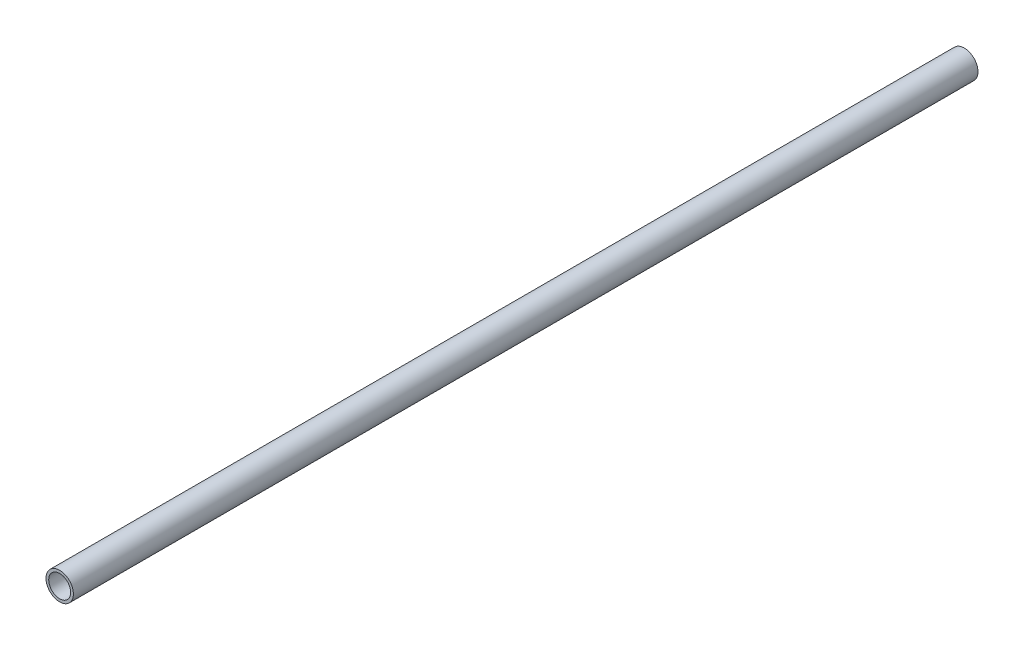
ISO-10303-21;
HEADER;
FILE_DESCRIPTION(('STEP AP214'),'2;1');
FILE_NAME('part.step','',(''),(''),'','','');
FILE_SCHEMA(('AUTOMOTIVE_DESIGN { 1 0 10303 214 1 1 1 1 }'));
ENDSEC;
DATA;
#1=APPLICATION_CONTEXT('core data for automotive mechanical design processes');
#2=APPLICATION_PROTOCOL_DEFINITION('international standard','automotive_design',2000,#1);
#3=PRODUCT_CONTEXT('',#1,'mechanical');
#4=PRODUCT('Part','Part','',(#3));
#5=PRODUCT_RELATED_PRODUCT_CATEGORY('part','',(#4));
#6=PRODUCT_DEFINITION_FORMATION('','',#4);
#7=PRODUCT_DEFINITION_CONTEXT('part definition',#1,'design');
#8=PRODUCT_DEFINITION('design','',#6,#7);
#9=PRODUCT_DEFINITION_SHAPE('','',#8);
#10=(LENGTH_UNIT() NAMED_UNIT(*) SI_UNIT(.MILLI.,.METRE.));
#11=(NAMED_UNIT(*) PLANE_ANGLE_UNIT() SI_UNIT($,.RADIAN.));
#12=(NAMED_UNIT(*) SI_UNIT($,.STERADIAN.) SOLID_ANGLE_UNIT());
#13=UNCERTAINTY_MEASURE_WITH_UNIT(LENGTH_MEASURE(1.E-05),#10,'distance_accuracy_value','');
#14=(GEOMETRIC_REPRESENTATION_CONTEXT(3) GLOBAL_UNCERTAINTY_ASSIGNED_CONTEXT((#13)) GLOBAL_UNIT_ASSIGNED_CONTEXT((#10,
#11,#12)) REPRESENTATION_CONTEXT('',''));
#15=CARTESIAN_POINT('',(0.,0.,0.));
#16=DIRECTION('',(0.,0.,1.));
#17=DIRECTION('',(1.,0.,0.));
#18=AXIS2_PLACEMENT_3D('',#15,#16,#17);
#19=CARTESIAN_POINT('',(0.,-9.99200722162641E-13,330.));
#20=DIRECTION('',(0.,0.,1.));
#21=DIRECTION('',(1.,0.,0.));
#22=AXIS2_PLACEMENT_3D('',#19,#20,#21);
#23=PLANE('',#22);
#24=CARTESIAN_POINT('',(0.,-9.99200722162641E-13,330.));
#25=DIRECTION('',(0.,0.,1.));
#26=DIRECTION('',(1.,0.,0.));
#27=AXIS2_PLACEMENT_3D('',#24,#25,#26);
#28=CIRCLE('',#27,5.);
#29=CARTESIAN_POINT('',(5.,-9.99200722162641E-13,330.));
#30=VERTEX_POINT('',#29);
#31=EDGE_CURVE('E11',#30,#30,#28,.T.);
#32=ORIENTED_EDGE('',*,*,#31,.T.);
#33=EDGE_LOOP('',(#32));
#34=FACE_BOUND('',#33,.T.);
#35=CARTESIAN_POINT('',(0.,-9.99200722162641E-13,330.));
#36=DIRECTION('',(0.,0.,1.));
#37=DIRECTION('',(1.,0.,0.));
#38=AXIS2_PLACEMENT_3D('',#35,#36,#37);
#39=CIRCLE('',#38,4.);
#40=CARTESIAN_POINT('',(4.,-9.99200722162641E-13,330.));
#41=VERTEX_POINT('',#40);
#42=EDGE_CURVE('E48',#41,#41,#39,.T.);
#43=ORIENTED_EDGE('',*,*,#42,.F.);
#44=EDGE_LOOP('',(#43));
#45=FACE_BOUND('',#44,.T.);
#46=ADVANCED_FACE('F36',(#34,#45),#23,.T.);
#47=CARTESIAN_POINT('',(0.,0.,0.));
#48=DIRECTION('',(0.,0.,1.));
#49=DIRECTION('',(1.,0.,0.));
#50=AXIS2_PLACEMENT_3D('',#47,#48,#49);
#51=PLANE('',#50);
#52=CARTESIAN_POINT('',(0.,0.,0.));
#53=DIRECTION('',(0.,0.,1.));
#54=DIRECTION('',(1.,0.,0.));
#55=AXIS2_PLACEMENT_3D('',#52,#53,#54);
#56=CIRCLE('',#55,5.);
#57=CARTESIAN_POINT('',(5.,0.,0.));
#58=VERTEX_POINT('',#57);
#59=EDGE_CURVE('E40',#58,#58,#56,.T.);
#60=ORIENTED_EDGE('',*,*,#59,.F.);
#61=EDGE_LOOP('',(#60));
#62=FACE_BOUND('',#61,.T.);
#63=CARTESIAN_POINT('',(0.,0.,0.));
#64=DIRECTION('',(0.,0.,1.));
#65=DIRECTION('',(1.,0.,0.));
#66=AXIS2_PLACEMENT_3D('',#63,#64,#65);
#67=CIRCLE('',#66,4.);
#68=CARTESIAN_POINT('',(4.,0.,0.));
#69=VERTEX_POINT('',#68);
#70=EDGE_CURVE('E51',#69,#69,#67,.T.);
#71=ORIENTED_EDGE('',*,*,#70,.T.);
#72=EDGE_LOOP('',(#71));
#73=FACE_BOUND('',#72,.T.);
#74=ADVANCED_FACE('F64',(#62,#73),#51,.F.);
#75=CARTESIAN_POINT('',(0.,-9.99200722162641E-13,330.));
#76=DIRECTION('',(0.,0.,-1.));
#77=DIRECTION('',(-1.,0.,0.));
#78=AXIS2_PLACEMENT_3D('',#75,#76,#77);
#79=CYLINDRICAL_SURFACE('',#78,5.);
#80=ORIENTED_EDGE('',*,*,#31,.F.);
#81=EDGE_LOOP('',(#80));
#82=FACE_BOUND('',#81,.T.);
#83=ORIENTED_EDGE('',*,*,#59,.T.);
#84=EDGE_LOOP('',(#83));
#85=FACE_BOUND('',#84,.T.);
#86=ADVANCED_FACE('F38',(#82,#85),#79,.T.);
#87=CARTESIAN_POINT('',(0.,-9.99200722162641E-13,330.));
#88=DIRECTION('',(0.,0.,-1.));
#89=DIRECTION('',(-1.,0.,0.));
#90=AXIS2_PLACEMENT_3D('',#87,#88,#89);
#91=CYLINDRICAL_SURFACE('',#90,4.);
#92=ORIENTED_EDGE('',*,*,#42,.T.);
#93=EDGE_LOOP('',(#92));
#94=FACE_BOUND('',#93,.T.);
#95=ORIENTED_EDGE('',*,*,#70,.F.);
#96=EDGE_LOOP('',(#95));
#97=FACE_BOUND('',#96,.T.);
#98=ADVANCED_FACE('F60',(#94,#97),#91,.F.);
#99=CLOSED_SHELL('',(#46,#74,#86,#98));
#100=MANIFOLD_SOLID_BREP('B2',#99);
#101=ADVANCED_BREP_SHAPE_REPRESENTATION('',(#18,#100),#14);
#102=SHAPE_DEFINITION_REPRESENTATION(#9,#101);
ENDSEC;
END-ISO-10303-21;
